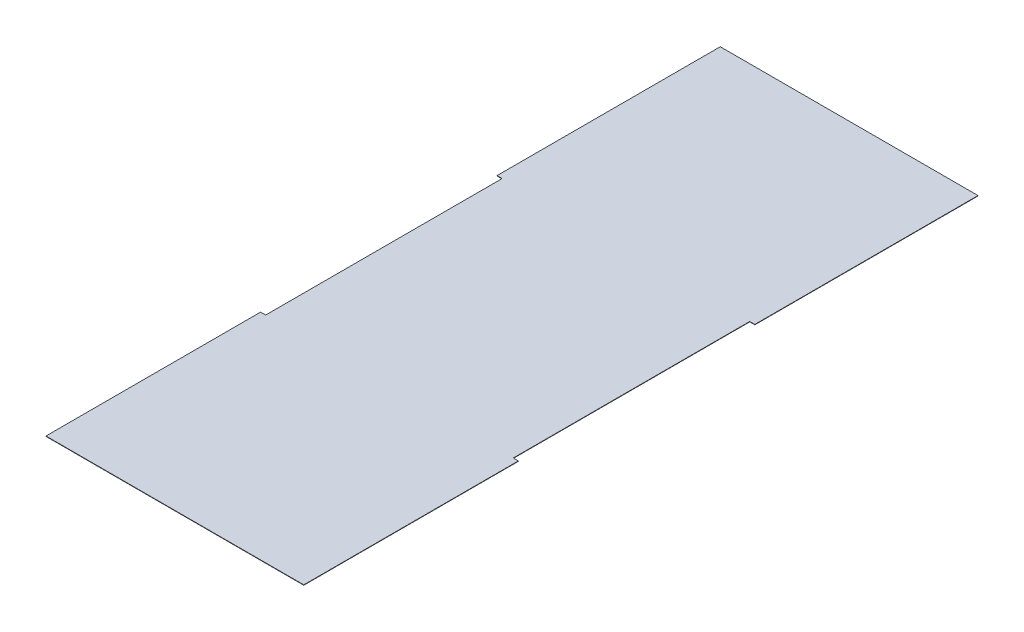
ISO-10303-21;
HEADER;
FILE_DESCRIPTION(('STEP AP214'),'2;1');
FILE_NAME('part.step','',(''),(''),'','','');
FILE_SCHEMA(('AUTOMOTIVE_DESIGN { 1 0 10303 214 1 1 1 1 }'));
ENDSEC;
DATA;
#1=APPLICATION_CONTEXT('core data for automotive mechanical design processes');
#2=APPLICATION_PROTOCOL_DEFINITION('international standard','automotive_design',2000,#1);
#3=PRODUCT_CONTEXT('',#1,'mechanical');
#4=PRODUCT('Part','Part','',(#3));
#5=PRODUCT_RELATED_PRODUCT_CATEGORY('part','',(#4));
#6=PRODUCT_DEFINITION_FORMATION('','',#4);
#7=PRODUCT_DEFINITION_CONTEXT('part definition',#1,'design');
#8=PRODUCT_DEFINITION('design','',#6,#7);
#9=PRODUCT_DEFINITION_SHAPE('','',#8);
#10=(LENGTH_UNIT() NAMED_UNIT(*) SI_UNIT(.MILLI.,.METRE.));
#11=(NAMED_UNIT(*) PLANE_ANGLE_UNIT() SI_UNIT($,.RADIAN.));
#12=(NAMED_UNIT(*) SI_UNIT($,.STERADIAN.) SOLID_ANGLE_UNIT());
#13=UNCERTAINTY_MEASURE_WITH_UNIT(LENGTH_MEASURE(1.E-05),#10,'distance_accuracy_value','');
#14=(GEOMETRIC_REPRESENTATION_CONTEXT(3) GLOBAL_UNCERTAINTY_ASSIGNED_CONTEXT((#13)) GLOBAL_UNIT_ASSIGNED_CONTEXT((#10,
#11,#12)) REPRESENTATION_CONTEXT('',''));
#15=CARTESIAN_POINT('',(0.,0.,0.));
#16=DIRECTION('',(0.,0.,1.));
#17=DIRECTION('',(1.,0.,0.));
#18=AXIS2_PLACEMENT_3D('',#15,#16,#17);
#19=CARTESIAN_POINT('',(1923.,3.,-5030.));
#20=DIRECTION('',(-1.,0.,0.));
#21=DIRECTION('',(0.,0.,1.));
#22=AXIS2_PLACEMENT_3D('',#19,#20,#21);
#23=PLANE('',#22);
#24=DIRECTION('',(0.,0.,-1.));
#25=VECTOR('',#24,1.);
#26=CARTESIAN_POINT('',(1923.,0.,-5030.));
#27=LINE('',#26,#25);
#28=CARTESIAN_POINT('',(1923.,0.,0.));
#29=VERTEX_POINT('',#28);
#30=CARTESIAN_POINT('',(1923.,0.,-1601.));
#31=VERTEX_POINT('',#30);
#32=EDGE_CURVE('E151',#29,#31,#27,.T.);
#33=ORIENTED_EDGE('',*,*,#32,.T.);
#34=DIRECTION('',(0.,1.,0.));
#35=VECTOR('',#34,1.);
#36=CARTESIAN_POINT('',(1923.,0.,-1601.));
#37=LINE('',#36,#35);
#38=CARTESIAN_POINT('',(1923.,3.,-1601.));
#39=VERTEX_POINT('',#38);
#40=EDGE_CURVE('E222',#31,#39,#37,.T.);
#41=ORIENTED_EDGE('',*,*,#40,.T.);
#42=DIRECTION('',(0.,0.,-1.));
#43=VECTOR('',#42,1.);
#44=CARTESIAN_POINT('',(1923.,3.,-5030.));
#45=LINE('',#44,#43);
#46=CARTESIAN_POINT('',(1923.,3.,0.));
#47=VERTEX_POINT('',#46);
#48=EDGE_CURVE('E207',#47,#39,#45,.T.);
#49=ORIENTED_EDGE('',*,*,#48,.F.);
#50=DIRECTION('',(0.,-1.,0.));
#51=VECTOR('',#50,1.);
#52=CARTESIAN_POINT('',(1923.,3.,0.));
#53=LINE('',#52,#51);
#54=EDGE_CURVE('E11',#47,#29,#53,.T.);
#55=ORIENTED_EDGE('',*,*,#54,.T.);
#56=EDGE_LOOP('',(#33,#41,#49,#55));
#57=FACE_BOUND('',#56,.T.);
#58=ADVANCED_FACE('F33',(#57),#23,.F.);
#59=CARTESIAN_POINT('',(0.,3.,0.));
#60=DIRECTION('',(1.,0.,0.));
#61=DIRECTION('',(0.,0.,-1.));
#62=AXIS2_PLACEMENT_3D('',#59,#60,#61);
#63=PLANE('',#62);
#64=DIRECTION('',(0.,0.,1.));
#65=VECTOR('',#64,1.);
#66=CARTESIAN_POINT('',(0.,0.,0.));
#67=LINE('',#66,#65);
#68=CARTESIAN_POINT('',(0.,0.,-5030.));
#69=VERTEX_POINT('',#68);
#70=CARTESIAN_POINT('',(0.,0.,-3365.));
#71=VERTEX_POINT('',#70);
#72=EDGE_CURVE('E146',#69,#71,#67,.T.);
#73=ORIENTED_EDGE('',*,*,#72,.T.);
#74=DIRECTION('',(0.,1.,0.));
#75=VECTOR('',#74,1.);
#76=CARTESIAN_POINT('',(0.,0.,-3365.));
#77=LINE('',#76,#75);
#78=CARTESIAN_POINT('',(0.,3.,-3365.));
#79=VERTEX_POINT('',#78);
#80=EDGE_CURVE('E179',#71,#79,#77,.T.);
#81=ORIENTED_EDGE('',*,*,#80,.T.);
#82=DIRECTION('',(0.,0.,1.));
#83=VECTOR('',#82,1.);
#84=CARTESIAN_POINT('',(0.,3.,0.));
#85=LINE('',#84,#83);
#86=CARTESIAN_POINT('',(0.,3.,-5030.));
#87=VERTEX_POINT('',#86);
#88=EDGE_CURVE('E158',#87,#79,#85,.T.);
#89=ORIENTED_EDGE('',*,*,#88,.F.);
#90=DIRECTION('',(0.,-1.,0.));
#91=VECTOR('',#90,1.);
#92=CARTESIAN_POINT('',(0.,3.,-5030.));
#93=LINE('',#92,#91);
#94=EDGE_CURVE('E157',#87,#69,#93,.T.);
#95=ORIENTED_EDGE('',*,*,#94,.T.);
#96=EDGE_LOOP('',(#73,#81,#89,#95));
#97=FACE_BOUND('',#96,.T.);
#98=ADVANCED_FACE('F177',(#97),#63,.F.);
#99=CARTESIAN_POINT('',(1923.,3.,0.));
#100=DIRECTION('',(0.,0.,-1.));
#101=DIRECTION('',(-1.,0.,0.));
#102=AXIS2_PLACEMENT_3D('',#99,#100,#101);
#103=PLANE('',#102);
#104=DIRECTION('',(1.,0.,0.));
#105=VECTOR('',#104,1.);
#106=CARTESIAN_POINT('',(1923.,0.,0.));
#107=LINE('',#106,#105);
#108=CARTESIAN_POINT('',(0.,0.,0.));
#109=VERTEX_POINT('',#108);
#110=EDGE_CURVE('E145',#109,#29,#107,.T.);
#111=ORIENTED_EDGE('',*,*,#110,.T.);
#112=ORIENTED_EDGE('',*,*,#54,.F.);
#113=DIRECTION('',(1.,0.,0.));
#114=VECTOR('',#113,1.);
#115=CARTESIAN_POINT('',(1923.,3.,0.));
#116=LINE('',#115,#114);
#117=CARTESIAN_POINT('',(0.,3.,0.));
#118=VERTEX_POINT('',#117);
#119=EDGE_CURVE('E150',#118,#47,#116,.T.);
#120=ORIENTED_EDGE('',*,*,#119,.F.);
#121=DIRECTION('',(0.,-1.,0.));
#122=VECTOR('',#121,1.);
#123=CARTESIAN_POINT('',(0.,3.,0.));
#124=LINE('',#123,#122);
#125=EDGE_CURVE('E155',#118,#109,#124,.T.);
#126=ORIENTED_EDGE('',*,*,#125,.T.);
#127=EDGE_LOOP('',(#111,#112,#120,#126));
#128=FACE_BOUND('',#127,.T.);
#129=ADVANCED_FACE('F35',(#128),#103,.F.);
#130=CARTESIAN_POINT('',(1923.,3.,-3365.));
#131=VERTEX_POINT('',#130);
#132=CARTESIAN_POINT('',(1923.,3.,-5030.));
#133=VERTEX_POINT('',#132);
#134=EDGE_CURVE('E193',#131,#133,#45,.T.);
#135=ORIENTED_EDGE('',*,*,#134,.F.);
#136=DIRECTION('',(0.,1.,0.));
#137=VECTOR('',#136,1.);
#138=CARTESIAN_POINT('',(1923.,0.,-3365.));
#139=LINE('',#138,#137);
#140=CARTESIAN_POINT('',(1923.,0.,-3365.));
#141=VERTEX_POINT('',#140);
#142=EDGE_CURVE('E192',#141,#131,#139,.T.);
#143=ORIENTED_EDGE('',*,*,#142,.F.);
#144=CARTESIAN_POINT('',(1923.,0.,-5030.));
#145=VERTEX_POINT('',#144);
#146=EDGE_CURVE('E173',#141,#145,#27,.T.);
#147=ORIENTED_EDGE('',*,*,#146,.T.);
#148=DIRECTION('',(0.,-1.,0.));
#149=VECTOR('',#148,1.);
#150=CARTESIAN_POINT('',(1923.,3.,-5030.));
#151=LINE('',#150,#149);
#152=EDGE_CURVE('E41',#133,#145,#151,.T.);
#153=ORIENTED_EDGE('',*,*,#152,.F.);
#154=EDGE_LOOP('',(#135,#143,#147,#153));
#155=FACE_BOUND('',#154,.T.);
#156=ADVANCED_FACE('F191',(#155),#23,.F.);
#157=CARTESIAN_POINT('',(0.,3.,-5030.));
#158=DIRECTION('',(0.,0.,1.));
#159=DIRECTION('',(1.,0.,0.));
#160=AXIS2_PLACEMENT_3D('',#157,#158,#159);
#161=PLANE('',#160);
#162=DIRECTION('',(-1.,0.,0.));
#163=VECTOR('',#162,1.);
#164=CARTESIAN_POINT('',(0.,0.,-5030.));
#165=LINE('',#164,#163);
#166=EDGE_CURVE('E147',#145,#69,#165,.T.);
#167=ORIENTED_EDGE('',*,*,#166,.T.);
#168=ORIENTED_EDGE('',*,*,#94,.F.);
#169=DIRECTION('',(-1.,0.,0.));
#170=VECTOR('',#169,1.);
#171=CARTESIAN_POINT('',(0.,3.,-5030.));
#172=LINE('',#171,#170);
#173=EDGE_CURVE('E167',#133,#87,#172,.T.);
#174=ORIENTED_EDGE('',*,*,#173,.F.);
#175=ORIENTED_EDGE('',*,*,#152,.T.);
#176=EDGE_LOOP('',(#167,#168,#174,#175));
#177=FACE_BOUND('',#176,.T.);
#178=ADVANCED_FACE('F165',(#177),#161,.F.);
#179=CARTESIAN_POINT('',(0.,3.,-1601.));
#180=VERTEX_POINT('',#179);
#181=EDGE_CURVE('E138',#180,#118,#85,.T.);
#182=ORIENTED_EDGE('',*,*,#181,.F.);
#183=DIRECTION('',(0.,1.,0.));
#184=VECTOR('',#183,1.);
#185=CARTESIAN_POINT('',(0.,0.,-1601.));
#186=LINE('',#185,#184);
#187=CARTESIAN_POINT('',(0.,0.,-1601.));
#188=VERTEX_POINT('',#187);
#189=EDGE_CURVE('E125',#188,#180,#186,.T.);
#190=ORIENTED_EDGE('',*,*,#189,.F.);
#191=EDGE_CURVE('E136',#188,#109,#67,.T.);
#192=ORIENTED_EDGE('',*,*,#191,.T.);
#193=ORIENTED_EDGE('',*,*,#125,.F.);
#194=EDGE_LOOP('',(#182,#190,#192,#193));
#195=FACE_BOUND('',#194,.T.);
#196=ADVANCED_FACE('F134',(#195),#63,.F.);
#197=CARTESIAN_POINT('',(0.,3.,0.));
#198=DIRECTION('',(0.,-1.,0.));
#199=DIRECTION('',(0.,0.,-1.));
#200=AXIS2_PLACEMENT_3D('',#197,#198,#199);
#201=PLANE('',#200);
#202=ORIENTED_EDGE('',*,*,#88,.T.);
#203=DIRECTION('',(-1.,0.,0.));
#204=VECTOR('',#203,1.);
#205=CARTESIAN_POINT('',(38.,3.,-3365.));
#206=LINE('',#205,#204);
#207=CARTESIAN_POINT('',(38.,3.,-3365.));
#208=VERTEX_POINT('',#207);
#209=EDGE_CURVE('E130',#208,#79,#206,.T.);
#210=ORIENTED_EDGE('',*,*,#209,.F.);
#211=DIRECTION('',(0.,0.,-1.));
#212=VECTOR('',#211,1.);
#213=CARTESIAN_POINT('',(38.,3.,-1601.));
#214=LINE('',#213,#212);
#215=CARTESIAN_POINT('',(38.,3.,-1601.));
#216=VERTEX_POINT('',#215);
#217=EDGE_CURVE('E236',#216,#208,#214,.T.);
#218=ORIENTED_EDGE('',*,*,#217,.F.);
#219=DIRECTION('',(1.,0.,0.));
#220=VECTOR('',#219,1.);
#221=CARTESIAN_POINT('',(0.,3.,-1601.));
#222=LINE('',#221,#220);
#223=EDGE_CURVE('E223',#180,#216,#222,.T.);
#224=ORIENTED_EDGE('',*,*,#223,.F.);
#225=ORIENTED_EDGE('',*,*,#181,.T.);
#226=ORIENTED_EDGE('',*,*,#119,.T.);
#227=ORIENTED_EDGE('',*,*,#48,.T.);
#228=DIRECTION('',(1.,0.,0.));
#229=VECTOR('',#228,1.);
#230=CARTESIAN_POINT('',(1885.,3.,-1601.));
#231=LINE('',#230,#229);
#232=CARTESIAN_POINT('',(1885.,3.,-1601.));
#233=VERTEX_POINT('',#232);
#234=EDGE_CURVE('E216',#233,#39,#231,.T.);
#235=ORIENTED_EDGE('',*,*,#234,.F.);
#236=DIRECTION('',(0.,0.,1.));
#237=VECTOR('',#236,1.);
#238=CARTESIAN_POINT('',(1885.,3.,-3365.));
#239=LINE('',#238,#237);
#240=CARTESIAN_POINT('',(1885.,3.,-3365.));
#241=VERTEX_POINT('',#240);
#242=EDGE_CURVE('E214',#241,#233,#239,.T.);
#243=ORIENTED_EDGE('',*,*,#242,.F.);
#244=DIRECTION('',(-1.,0.,0.));
#245=VECTOR('',#244,1.);
#246=CARTESIAN_POINT('',(1923.,3.,-3365.));
#247=LINE('',#246,#245);
#248=EDGE_CURVE('E212',#131,#241,#247,.T.);
#249=ORIENTED_EDGE('',*,*,#248,.F.);
#250=ORIENTED_EDGE('',*,*,#134,.T.);
#251=ORIENTED_EDGE('',*,*,#173,.T.);
#252=EDGE_LOOP('',(#202,#210,#218,#224,#225,#226,#227,#235,#243,#249,#250,#251));
#253=FACE_BOUND('',#252,.T.);
#254=ADVANCED_FACE('F210',(#253),#201,.F.);
#255=CARTESIAN_POINT('',(0.,0.,0.));
#256=DIRECTION('',(0.,-1.,0.));
#257=DIRECTION('',(0.,0.,-1.));
#258=AXIS2_PLACEMENT_3D('',#255,#256,#257);
#259=PLANE('',#258);
#260=DIRECTION('',(-1.,0.,0.));
#261=VECTOR('',#260,1.);
#262=CARTESIAN_POINT('',(38.,0.,-3365.));
#263=LINE('',#262,#261);
#264=CARTESIAN_POINT('',(38.,0.,-3365.));
#265=VERTEX_POINT('',#264);
#266=EDGE_CURVE('E139',#265,#71,#263,.T.);
#267=ORIENTED_EDGE('',*,*,#266,.T.);
#268=ORIENTED_EDGE('',*,*,#72,.F.);
#269=ORIENTED_EDGE('',*,*,#166,.F.);
#270=ORIENTED_EDGE('',*,*,#146,.F.);
#271=DIRECTION('',(-1.,0.,0.));
#272=VECTOR('',#271,1.);
#273=CARTESIAN_POINT('',(1923.,0.,-3365.));
#274=LINE('',#273,#272);
#275=CARTESIAN_POINT('',(1885.,0.,-3365.));
#276=VERTEX_POINT('',#275);
#277=EDGE_CURVE('E221',#141,#276,#274,.T.);
#278=ORIENTED_EDGE('',*,*,#277,.T.);
#279=DIRECTION('',(0.,0.,1.));
#280=VECTOR('',#279,1.);
#281=CARTESIAN_POINT('',(1885.,0.,-3365.));
#282=LINE('',#281,#280);
#283=CARTESIAN_POINT('',(1885.,0.,-1601.));
#284=VERTEX_POINT('',#283);
#285=EDGE_CURVE('E56',#276,#284,#282,.T.);
#286=ORIENTED_EDGE('',*,*,#285,.T.);
#287=DIRECTION('',(1.,0.,0.));
#288=VECTOR('',#287,1.);
#289=CARTESIAN_POINT('',(1885.,0.,-1601.));
#290=LINE('',#289,#288);
#291=EDGE_CURVE('E198',#284,#31,#290,.T.);
#292=ORIENTED_EDGE('',*,*,#291,.T.);
#293=ORIENTED_EDGE('',*,*,#32,.F.);
#294=ORIENTED_EDGE('',*,*,#110,.F.);
#295=ORIENTED_EDGE('',*,*,#191,.F.);
#296=DIRECTION('',(1.,0.,0.));
#297=VECTOR('',#296,1.);
#298=CARTESIAN_POINT('',(0.,0.,-1601.));
#299=LINE('',#298,#297);
#300=CARTESIAN_POINT('',(38.,0.,-1601.));
#301=VERTEX_POINT('',#300);
#302=EDGE_CURVE('E121',#188,#301,#299,.T.);
#303=ORIENTED_EDGE('',*,*,#302,.T.);
#304=DIRECTION('',(0.,0.,-1.));
#305=VECTOR('',#304,1.);
#306=CARTESIAN_POINT('',(38.,0.,-1601.));
#307=LINE('',#306,#305);
#308=EDGE_CURVE('E48',#301,#265,#307,.T.);
#309=ORIENTED_EDGE('',*,*,#308,.T.);
#310=EDGE_LOOP('',(#267,#268,#269,#270,#278,#286,#292,#293,#294,#295,#303,#309));
#311=FACE_BOUND('',#310,.T.);
#312=ADVANCED_FACE('F143',(#311),#259,.T.);
#313=CARTESIAN_POINT('',(1885.,0.,-1601.));
#314=DIRECTION('',(0.,0.,1.));
#315=DIRECTION('',(1.,0.,0.));
#316=AXIS2_PLACEMENT_3D('',#313,#314,#315);
#317=PLANE('',#316);
#318=ORIENTED_EDGE('',*,*,#234,.T.);
#319=ORIENTED_EDGE('',*,*,#40,.F.);
#320=ORIENTED_EDGE('',*,*,#291,.F.);
#321=DIRECTION('',(0.,1.,0.));
#322=VECTOR('',#321,1.);
#323=CARTESIAN_POINT('',(1885.,0.,-1601.));
#324=LINE('',#323,#322);
#325=EDGE_CURVE('E200',#284,#233,#324,.T.);
#326=ORIENTED_EDGE('',*,*,#325,.T.);
#327=EDGE_LOOP('',(#318,#319,#320,#326));
#328=FACE_BOUND('',#327,.T.);
#329=ADVANCED_FACE('F226',(#328),#317,.F.);
#330=CARTESIAN_POINT('',(1885.,0.,-3365.));
#331=DIRECTION('',(-1.,0.,0.));
#332=DIRECTION('',(0.,0.,1.));
#333=AXIS2_PLACEMENT_3D('',#330,#331,#332);
#334=PLANE('',#333);
#335=ORIENTED_EDGE('',*,*,#242,.T.);
#336=ORIENTED_EDGE('',*,*,#325,.F.);
#337=ORIENTED_EDGE('',*,*,#285,.F.);
#338=DIRECTION('',(0.,1.,0.));
#339=VECTOR('',#338,1.);
#340=CARTESIAN_POINT('',(1885.,0.,-3365.));
#341=LINE('',#340,#339);
#342=EDGE_CURVE('E197',#276,#241,#341,.T.);
#343=ORIENTED_EDGE('',*,*,#342,.T.);
#344=EDGE_LOOP('',(#335,#336,#337,#343));
#345=FACE_BOUND('',#344,.T.);
#346=ADVANCED_FACE('F227',(#345),#334,.F.);
#347=CARTESIAN_POINT('',(1923.,0.,-3365.));
#348=DIRECTION('',(0.,0.,-1.));
#349=DIRECTION('',(-1.,0.,0.));
#350=AXIS2_PLACEMENT_3D('',#347,#348,#349);
#351=PLANE('',#350);
#352=ORIENTED_EDGE('',*,*,#248,.T.);
#353=ORIENTED_EDGE('',*,*,#342,.F.);
#354=ORIENTED_EDGE('',*,*,#277,.F.);
#355=ORIENTED_EDGE('',*,*,#142,.T.);
#356=EDGE_LOOP('',(#352,#353,#354,#355));
#357=FACE_BOUND('',#356,.T.);
#358=ADVANCED_FACE('F228',(#357),#351,.F.);
#359=CARTESIAN_POINT('',(38.,0.,-3365.));
#360=DIRECTION('',(0.,0.,-1.));
#361=DIRECTION('',(-1.,0.,0.));
#362=AXIS2_PLACEMENT_3D('',#359,#360,#361);
#363=PLANE('',#362);
#364=ORIENTED_EDGE('',*,*,#209,.T.);
#365=ORIENTED_EDGE('',*,*,#80,.F.);
#366=ORIENTED_EDGE('',*,*,#266,.F.);
#367=DIRECTION('',(0.,1.,0.));
#368=VECTOR('',#367,1.);
#369=CARTESIAN_POINT('',(38.,0.,-3365.));
#370=LINE('',#369,#368);
#371=EDGE_CURVE('E232',#265,#208,#370,.T.);
#372=ORIENTED_EDGE('',*,*,#371,.T.);
#373=EDGE_LOOP('',(#364,#365,#366,#372));
#374=FACE_BOUND('',#373,.T.);
#375=ADVANCED_FACE('F244',(#374),#363,.F.);
#376=CARTESIAN_POINT('',(38.,0.,-1601.));
#377=DIRECTION('',(1.,0.,0.));
#378=DIRECTION('',(0.,0.,-1.));
#379=AXIS2_PLACEMENT_3D('',#376,#377,#378);
#380=PLANE('',#379);
#381=ORIENTED_EDGE('',*,*,#217,.T.);
#382=ORIENTED_EDGE('',*,*,#371,.F.);
#383=ORIENTED_EDGE('',*,*,#308,.F.);
#384=DIRECTION('',(0.,1.,0.));
#385=VECTOR('',#384,1.);
#386=CARTESIAN_POINT('',(38.,0.,-1601.));
#387=LINE('',#386,#385);
#388=EDGE_CURVE('E127',#301,#216,#387,.T.);
#389=ORIENTED_EDGE('',*,*,#388,.T.);
#390=EDGE_LOOP('',(#381,#382,#383,#389));
#391=FACE_BOUND('',#390,.T.);
#392=ADVANCED_FACE('F242',(#391),#380,.F.);
#393=CARTESIAN_POINT('',(0.,0.,-1601.));
#394=DIRECTION('',(0.,0.,1.));
#395=DIRECTION('',(1.,0.,0.));
#396=AXIS2_PLACEMENT_3D('',#393,#394,#395);
#397=PLANE('',#396);
#398=ORIENTED_EDGE('',*,*,#223,.T.);
#399=ORIENTED_EDGE('',*,*,#388,.F.);
#400=ORIENTED_EDGE('',*,*,#302,.F.);
#401=ORIENTED_EDGE('',*,*,#189,.T.);
#402=EDGE_LOOP('',(#398,#399,#400,#401));
#403=FACE_BOUND('',#402,.T.);
#404=ADVANCED_FACE('F124',(#403),#397,.F.);
#405=CLOSED_SHELL('',(#58,#98,#129,#156,#178,#196,#254,#312,#329,#346,#358,#375,#392,#404));
#406=MANIFOLD_SOLID_BREP('B2',#405);
#407=ADVANCED_BREP_SHAPE_REPRESENTATION('',(#18,#406),#14);
#408=SHAPE_DEFINITION_REPRESENTATION(#9,#407);
ENDSEC;
END-ISO-10303-21;
